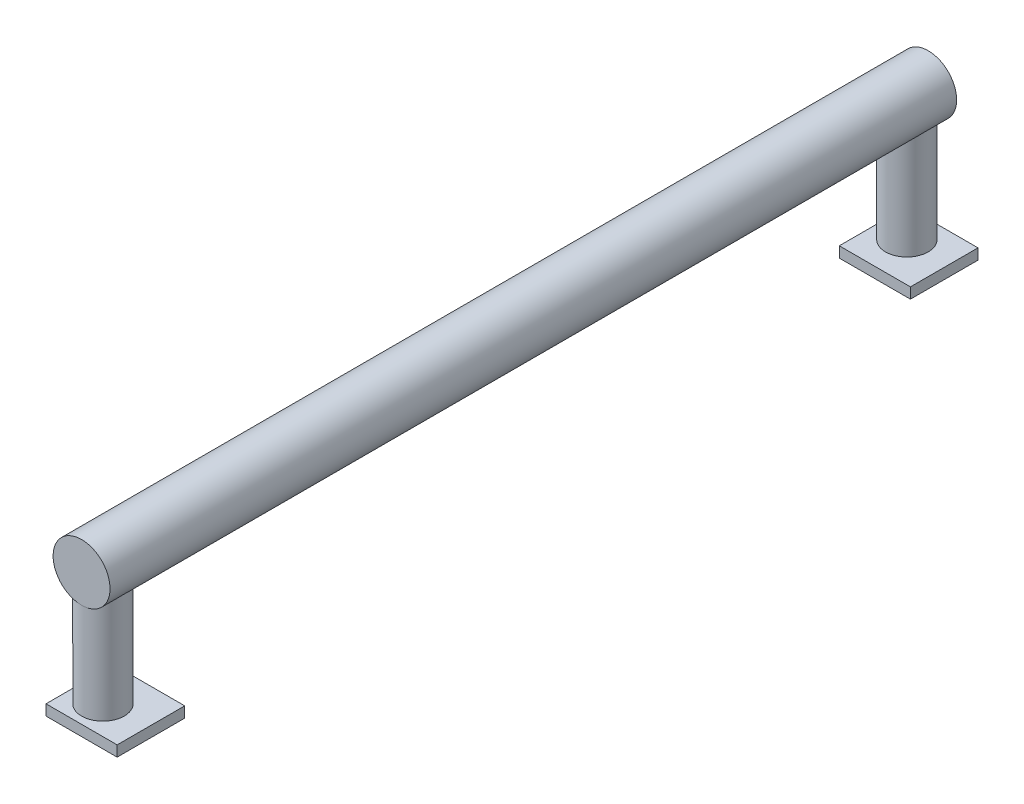
ISO-10303-21;
HEADER;
FILE_DESCRIPTION(('STEP AP214'),'2;1');
FILE_NAME('part.step','',(''),(''),'','','');
FILE_SCHEMA(('AUTOMOTIVE_DESIGN { 1 0 10303 214 1 1 1 1 }'));
ENDSEC;
DATA;
#1=APPLICATION_CONTEXT('core data for automotive mechanical design processes');
#2=APPLICATION_PROTOCOL_DEFINITION('international standard','automotive_design',2000,#1);
#3=PRODUCT_CONTEXT('',#1,'mechanical');
#4=PRODUCT('Part','Part','',(#3));
#5=PRODUCT_RELATED_PRODUCT_CATEGORY('part','',(#4));
#6=PRODUCT_DEFINITION_FORMATION('','',#4);
#7=PRODUCT_DEFINITION_CONTEXT('part definition',#1,'design');
#8=PRODUCT_DEFINITION('design','',#6,#7);
#9=PRODUCT_DEFINITION_SHAPE('','',#8);
#10=(LENGTH_UNIT() NAMED_UNIT(*) SI_UNIT(.MILLI.,.METRE.));
#11=(NAMED_UNIT(*) PLANE_ANGLE_UNIT() SI_UNIT($,.RADIAN.));
#12=(NAMED_UNIT(*) SI_UNIT($,.STERADIAN.) SOLID_ANGLE_UNIT());
#13=UNCERTAINTY_MEASURE_WITH_UNIT(LENGTH_MEASURE(1.E-05),#10,'distance_accuracy_value','');
#14=(GEOMETRIC_REPRESENTATION_CONTEXT(3) GLOBAL_UNCERTAINTY_ASSIGNED_CONTEXT((#13)) GLOBAL_UNIT_ASSIGNED_CONTEXT((#10,
#11,#12)) REPRESENTATION_CONTEXT('',''));
#15=CARTESIAN_POINT('',(0.,0.,0.));
#16=DIRECTION('',(0.,0.,1.));
#17=DIRECTION('',(1.,0.,0.));
#18=AXIS2_PLACEMENT_3D('',#15,#16,#17);
#19=CARTESIAN_POINT('',(-2.,38.,119.));
#20=DIRECTION('',(0.,0.,-1.));
#21=DIRECTION('',(-1.,0.,0.));
#22=AXIS2_PLACEMENT_3D('',#19,#20,#21);
#23=CYLINDRICAL_SURFACE('',#22,8.);
#24=CARTESIAN_POINT('',(-2.,38.,119.));
#25=DIRECTION('',(0.,0.,1.));
#26=DIRECTION('',(1.,0.,0.));
#27=AXIS2_PLACEMENT_3D('',#24,#25,#26);
#28=CIRCLE('',#27,8.);
#29=CARTESIAN_POINT('',(-2.,30.,119.));
#30=VERTEX_POINT('',#29);
#31=EDGE_CURVE('E174',#30,#30,#28,.T.);
#32=ORIENTED_EDGE('',*,*,#31,.F.);
#33=CARTESIAN_POINT('',(-2.,30.,107.));
#34=CARTESIAN_POINT('',(-2.14651868851761,30.0000013982883,107.000001448881));
#35=CARTESIAN_POINT('',(-2.29307406811185,30.004035026396,107.005376765314));
#36=CARTESIAN_POINT('',(-2.58502771834388,30.0200788549777,107.026793971473));
#37=CARTESIAN_POINT('',(-2.73042524389379,30.0320938283545,107.04284224371));
#38=CARTESIAN_POINT('',(-3.01911421051197,30.0638465696049,107.085379802046));
#39=CARTESIAN_POINT('',(-3.16240109542144,30.083599053162,107.111888984073));
#40=CARTESIAN_POINT('',(-3.44559149803457,30.1303826191203,107.174940025875));
#41=CARTESIAN_POINT('',(-3.5854934751382,30.1574169502915,107.211486363832));
#42=CARTESIAN_POINT('',(-3.86005596235382,30.2179809749031,107.293810942603));
#43=CARTESIAN_POINT('',(-3.99474491007821,30.2514667462575,107.339526837997));
#44=CARTESIAN_POINT('',(-4.25916456615398,30.3243880848115,107.439766669672));
#45=CARTESIAN_POINT('',(-4.38889328753647,30.3638260056681,107.494294090898));
#46=CARTESIAN_POINT('',(-4.76953920253634,30.4899452558965,107.67011829361));
#47=CARTESIAN_POINT('',(-5.012273741598,30.5845138159048,107.803766274043));
#48=CARTESIAN_POINT('',(-5.49390424837201,30.7980233345514,108.113063434282));
#49=CARTESIAN_POINT('',(-5.73036317555957,30.9184103024823,108.291455995929));
#50=CARTESIAN_POINT('',(-6.17211842741705,31.1693366672928,108.677996691612));
#51=CARTESIAN_POINT('',(-6.37736561247849,31.2998915938172,108.886190764897));
#52=CARTESIAN_POINT('',(-6.67986589059047,31.5101556120509,109.241071398588));
#53=CARTESIAN_POINT('',(-6.78758959632834,31.589421823506,109.379260942446));
#54=CARTESIAN_POINT('',(-6.99096674059028,31.7464621015653,109.665177543805));
#55=CARTESIAN_POINT('',(-7.08661653937946,31.8242357122553,109.812907457104));
#56=CARTESIAN_POINT('',(-7.26524223271028,31.9758044528287,110.117576909851));
#57=CARTESIAN_POINT('',(-7.34823079501831,32.0496035108309,110.274507023772));
#58=CARTESIAN_POINT('',(-7.50089012691617,32.1904400592364,110.59747433433));
#59=CARTESIAN_POINT('',(-7.5705684784342,32.257481388719,110.763506276478));
#60=CARTESIAN_POINT('',(-7.71520702483237,32.4009123462405,111.157962838089));
#61=CARTESIAN_POINT('',(-7.78504300911228,32.4737016067238,111.389703214404));
#62=CARTESIAN_POINT('',(-7.86893397672822,32.5633383544601,111.746775779162));
#63=CARTESIAN_POINT('',(-7.89341250881845,32.5899498803775,111.867306149321));
#64=CARTESIAN_POINT('',(-7.93505989442207,32.6356712225518,112.111001334768));
#65=CARTESIAN_POINT('',(-7.95223251488978,32.6547849043268,112.234164757956));
#66=CARTESIAN_POINT('',(-7.9790556619836,32.6848041011853,112.483507738135));
#67=CARTESIAN_POINT('',(-7.98863344669946,32.6956302061545,112.609704809686));
#68=CARTESIAN_POINT('',(-7.99977184971055,32.7082318903186,112.862906861699));
#69=CARTESIAN_POINT('',(-8.00133268798461,32.710007717846,112.989911819899));
#70=CARTESIAN_POINT('',(-7.99639499670828,32.704411031936,113.243605636647));
#71=CARTESIAN_POINT('',(-7.98989382945216,32.6970355243883,113.370294378144));
#72=CARTESIAN_POINT('',(-7.96899506203212,32.6735253324189,113.622165435523));
#73=CARTESIAN_POINT('',(-7.95459738141669,32.6573905587558,113.747347736043));
#74=CARTESIAN_POINT('',(-7.90390904957868,32.6012720361877,114.092599749607));
#75=CARTESIAN_POINT('',(-7.85930415163495,32.5525084951805,114.310084453616));
#76=CARTESIAN_POINT('',(-7.74822214390399,32.4354375136564,114.733816604228));
#77=CARTESIAN_POINT('',(-7.68172401138876,32.3671112965567,114.940053027047));
#78=CARTESIAN_POINT('',(-7.54333905811536,32.2312067687968,115.302535586605));
#79=CARTESIAN_POINT('',(-7.47477466886077,32.1658691893842,115.460927539078));
#80=CARTESIAN_POINT('',(-7.32546089576458,32.0292626727821,115.769264786509));
#81=CARTESIAN_POINT('',(-7.24470526282515,31.9579907021398,115.919205695107));
#82=CARTESIAN_POINT('',(-7.07146578081444,31.811857415066,116.210771068739));
#83=CARTESIAN_POINT('',(-6.97895793325039,31.7369889546789,116.352377623602));
#84=CARTESIAN_POINT('',(-6.78275541489667,31.5859075704412,116.626802307504));
#85=CARTESIAN_POINT('',(-6.6790624980525,31.5096948589477,116.759621809199));
#86=CARTESIAN_POINT('',(-6.45797922408577,31.3558283738477,117.019483960837));
#87=CARTESIAN_POINT('',(-6.34030912342671,31.2781868020496,117.146296073562));
#88=CARTESIAN_POINT('',(-6.09367222460923,31.1251974932055,117.389977037136));
#89=CARTESIAN_POINT('',(-5.96470428502757,31.0498499889683,117.506844880956));
#90=CARTESIAN_POINT('',(-5.69597060021902,30.9032976812231,117.729716189844));
#91=CARTESIAN_POINT('',(-5.55622538384286,30.8320854333905,117.835739457189));
#92=CARTESIAN_POINT('',(-5.26604522385207,30.6952982256104,118.036272685936));
#93=CARTESIAN_POINT('',(-5.1156094341371,30.6297237127685,118.130781734442));
#94=CARTESIAN_POINT('',(-4.83586827048304,30.5183054866526,118.289448504501));
#95=CARTESIAN_POINT('',(-4.70837998934683,30.4711428967607,118.355891187227));
#96=CARTESIAN_POINT('',(-4.44739928983842,30.3823083204886,118.480064701747));
#97=CARTESIAN_POINT('',(-4.31390811354258,30.3406352052135,118.537797325096));
#98=CARTESIAN_POINT('',(-4.04151155204905,30.2635757750186,118.643898411202));
#99=CARTESIAN_POINT('',(-3.90260706454456,30.2281884230903,118.692268418697));
#100=CARTESIAN_POINT('',(-3.62018599744476,30.1644437959674,118.778996945211));
#101=CARTESIAN_POINT('',(-3.47667131977366,30.1360836627363,118.817359534678));
#102=CARTESIAN_POINT('',(-3.18499204510421,30.086858658869,118.883732252647));
#103=CARTESIAN_POINT('',(-3.03680340577374,30.0660433713216,118.91167393067));
#104=CARTESIAN_POINT('',(-2.73782157199409,30.0326766113869,118.956380087926));
#105=CARTESIAN_POINT('',(-2.58702837120375,30.0201251591218,118.973144539942));
#106=CARTESIAN_POINT('',(-2.28418439033455,30.0036115625124,118.995188189966));
#107=CARTESIAN_POINT('',(-2.13213404661231,29.9996465538777,119.000471217982));
#108=CARTESIAN_POINT('',(-1.82810072219403,30.0004028609765,118.999462895463));
#109=CARTESIAN_POINT('',(-1.67611773713387,30.0051234922391,118.993172456973));
#110=CARTESIAN_POINT('',(-1.38885732653065,30.0222136134953,118.970353822955));
#111=CARTESIAN_POINT('',(-1.25344163413746,30.0337632650399,118.954922670581));
#112=CARTESIAN_POINT('',(-0.984649253020068,30.0635427405215,118.915025782578));
#113=CARTESIAN_POINT('',(-0.851273257776608,30.0817747860342,118.890557042363));
#114=CARTESIAN_POINT('',(-0.587482739790202,30.1245546726839,118.832924913315));
#115=CARTESIAN_POINT('',(-0.457067509664634,30.1491009875674,118.799763625563));
#116=CARTESIAN_POINT('',(-0.199870513613942,30.2040483182649,118.725163126504));
#117=CARTESIAN_POINT('',(-0.0730901757217983,30.2344515998443,118.683720711414));
#118=CARTESIAN_POINT('',(0.309517067364628,30.3359821879528,118.544487843983));
#119=CARTESIAN_POINT('',(0.558474973627185,30.4159100225526,118.433806524393));
#120=CARTESIAN_POINT('',(1.03411583046436,30.5933285504639,118.183298926637));
#121=CARTESIAN_POINT('',(1.26079569312708,30.6908216731712,118.043468616552));
#122=CARTESIAN_POINT('',(1.72602689058001,30.9152256305774,117.712875221749));
#123=CARTESIAN_POINT('',(1.96023886187638,31.0443302362655,117.517506089552));
#124=CARTESIAN_POINT('',(2.3949072454606,31.310467908069,117.095944697078));
#125=CARTESIAN_POINT('',(2.59528664972404,31.4475181326754,116.869684183658));
#126=CARTESIAN_POINT('',(2.8864698356734,31.6643210584706,116.486351169057));
#127=CARTESIAN_POINT('',(2.98880902725895,31.7448245789116,116.338316822413));
#128=CARTESIAN_POINT('',(3.18051065872931,31.9026478608298,116.032314005009));
#129=CARTESIAN_POINT('',(3.26986833077175,31.979966445114,115.874341914694));
#130=CARTESIAN_POINT('',(3.43468173346093,32.1283302303333,115.548997297686));
#131=CARTESIAN_POINT('',(3.51017014215579,32.1993899667166,115.381648112373));
#132=CARTESIAN_POINT('',(3.64645066864906,32.3319652962539,115.037606580636));
#133=CARTESIAN_POINT('',(3.70725497051845,32.3934887867757,114.860922129515));
#134=CARTESIAN_POINT('',(3.82460895757244,32.5152340937909,114.458383334292));
#135=CARTESIAN_POINT('',(3.87724209021695,32.5721573854536,114.230297970467));
#136=CARTESIAN_POINT('',(3.93609963223253,32.6368343980076,113.881291066224));
#137=CARTESIAN_POINT('',(3.95236673030503,32.6549378612809,113.763874574703));
#138=CARTESIAN_POINT('',(3.97795743368828,32.6835723107174,113.527390450559));
#139=CARTESIAN_POINT('',(3.98728413098441,32.6941066688848,113.408323577302));
#140=CARTESIAN_POINT('',(3.99883169968423,32.7071657047085,113.168761991903));
#141=CARTESIAN_POINT('',(4.00101405659181,32.7096469682421,113.048263043999));
#142=CARTESIAN_POINT('',(3.99811868579162,32.7063644902143,112.80746834986));
#143=CARTESIAN_POINT('',(3.99304111065808,32.7006009219258,112.687172599408));
#144=CARTESIAN_POINT('',(3.97572919486202,32.6810876600826,112.447646847338));
#145=CARTESIAN_POINT('',(3.9634882595833,32.6673306077795,112.328417930672));
#146=CARTESIAN_POINT('',(3.93208637284381,32.6324215364621,112.091928887489));
#147=CARTESIAN_POINT('',(3.91292183985972,32.6112656902905,111.974669812869));
#148=CARTESIAN_POINT('',(3.86311195375072,32.5570640711415,111.717585137071));
#149=CARTESIAN_POINT('',(3.83087573361471,32.5224327089045,111.578401943099));
#150=CARTESIAN_POINT('',(3.7572636499831,32.4451139998036,111.304704465547));
#151=CARTESIAN_POINT('',(3.7158808885681,32.4024205764453,111.170193794848));
#152=CARTESIAN_POINT('',(3.62450733742018,32.3106137158993,110.906084124199));
#153=CARTESIAN_POINT('',(3.57449949488313,32.261487607771,110.776495487104));
#154=CARTESIAN_POINT('',(3.46646540651009,32.1584824246,110.522749887657));
#155=CARTESIAN_POINT('',(3.4084416038524,32.104604799571,110.398591285412));
#156=CARTESIAN_POINT('',(3.26327089727892,31.9741797813228,110.113531526032));
#157=CARTESIAN_POINT('',(3.17300719309852,31.8962564031756,109.954840832227));
#158=CARTESIAN_POINT('',(2.97927518139015,31.7372096196496,109.647412486605));
#159=CARTESIAN_POINT('',(2.87580275952893,31.6560852226607,109.498677958096));
#160=CARTESIAN_POINT('',(2.65600132814069,31.4930505710786,109.211280145984));
#161=CARTESIAN_POINT('',(2.53966269090389,31.4111397704523,109.072624534713));
#162=CARTESIAN_POINT('',(2.29448893143749,31.2487790785597,108.805936854109));
#163=CARTESIAN_POINT('',(2.16565532793775,31.168329011153,108.677903497171));
#164=CARTESIAN_POINT('',(1.89458755688542,31.0102207620581,108.432074742258));
#165=CARTESIAN_POINT('',(1.75224983935817,30.932591736701,108.314374460691));
#166=CARTESIAN_POINT('',(1.45541107812881,30.7828143209134,108.091376006562));
#167=CARTESIAN_POINT('',(1.30090844848122,30.7106666475066,107.986079455563));
#168=CARTESIAN_POINT('',(0.980611436470356,30.5739499714069,107.789317467789));
#169=CARTESIAN_POINT('',(0.814839343145992,30.5093666594798,107.697825819028));
#170=CARTESIAN_POINT('',(0.472665900366074,30.3895642279134,107.529881558582));
#171=CARTESIAN_POINT('',(0.29627009831926,30.3343402775569,107.453421185412));
#172=CARTESIAN_POINT('',(-0.0127007534033492,30.2496277909862,107.337018861803));
#173=CARTESIAN_POINT('',(-0.142967953511653,30.2173401364328,107.292941606809));
#174=CARTESIAN_POINT('',(-0.407486390523727,30.1589396031719,107.213554368136));
#175=CARTESIAN_POINT('',(-0.541736651119853,30.1328252251478,107.178242255543));
#176=CARTESIAN_POINT('',(-0.813129284043095,30.0873374542946,107.116918323619));
#177=CARTESIAN_POINT('',(-0.950264180180657,30.0679484803017,107.09088500362));
#178=CARTESIAN_POINT('',(-1.22676767892853,30.0362411542406,107.048390432802));
#179=CARTESIAN_POINT('',(-1.36613510169996,30.0239191864075,107.031924286976));
#180=CARTESIAN_POINT('',(-1.58813127445318,30.0101859849803,107.013586558735));
#181=CARTESIAN_POINT('',(-1.67036403162887,30.0063696580895,107.008495078511));
#182=CARTESIAN_POINT('',(-1.83506062721647,30.0012760676831,107.001701118577));
#183=CARTESIAN_POINT('',(-1.91752450068857,29.9999992129023,106.999999184424));
#184=CARTESIAN_POINT('',(-2.,30.,107.));
#185=B_SPLINE_CURVE_WITH_KNOTS('',3,(#33,#34,#35,#36,#37,#38,#39,#40,#41,#42,#43,#44,#45,#46,
#47,#48,#49,#50,#51,#52,#53,#54,#55,#56,#57,#58,#59,#60,#61,#62,#63,#64,#65,#66,#67,#68,#69,#70,
#71,#72,#73,#74,#75,#76,#77,#78,#79,#80,#81,#82,#83,#84,#85,#86,#87,#88,#89,#90,#91,#92,#93,#94,
#95,#96,#97,#98,#99,#100,#101,#102,#103,#104,#105,#106,#107,#108,#109,#110,#111,#112,#113,#114,
#115,#116,#117,#118,#119,#120,#121,#122,#123,#124,#125,#126,#127,#128,#129,#130,#131,#132,#133,
#134,#135,#136,#137,#138,#139,#140,#141,#142,#143,#144,#145,#146,#147,#148,#149,#150,#151,#152,
#153,#154,#155,#156,#157,#158,#159,#160,#161,#162,#163,#164,#165,#166,#167,#168,#169,#170,#171,
#172,#173,#174,#175,#176,#177,#178,#179,#180,#181,#182,#183,#184),.UNSPECIFIED.,.T.,.F.,(4,2,2,
2,2,2,2,2,2,2,2,2,2,2,2,2,2,2,2,2,2,2,2,2,2,2,2,2,2,2,2,2,2,2,2,2,2,2,2,2,2,2,2,2,2,2,2,2,2,2,2,
2,2,2,2,2,2,2,2,2,2,2,2,2,2,2,2,2,2,2,2,2,2,2,2,4),(0.,0.439467048380188,0.87919713813798,
1.31976762661366,1.76053500052094,2.19840134580812,2.63644129232571,3.51138555342936,
4.46735321072937,5.42481069423868,6.00121633672615,6.5777953264835,7.15379360241392,
7.72946278616467,8.48458056510052,8.86171322500427,9.23865119759489,9.61915721770107,
9.99965279695981,10.3802728986115,10.7608968781809,11.4400527126809,12.1198626101981,
12.672786977991,13.2259957371829,13.7803528972941,14.3346232539533,14.9028885365166,
15.4712112974089,16.0384770407194,16.6057877301158,17.0592631596222,17.5126451871165,
17.9659523472327,18.4190748392931,18.8751233602148,19.331172991604,19.7870704692073,
20.2429320214021,20.6527966790804,21.0627977208993,21.4726997523065,21.8827606737579,
22.7310038456726,23.5793644254271,24.5694015495635,25.5616626256785,26.1525200779509,
26.7435939942103,27.3332568743274,27.9224287902262,28.6419314131392,29.0012926759906,
29.3604937454876,29.7216280742576,30.0827548135648,30.4442145316699,30.8058614984406,
31.2462116660306,31.6868950664313,32.1284599525693,32.5698905501963,33.1645896617994,
33.7594744680457,34.3548074740318,34.9500682093495,35.550333147422,36.1506764723156,
36.7498651522012,37.3487436202511,37.7721112122056,38.1953758741032,38.6176532780525,
39.039714434693,39.2870510185101,39.5344274085992),.UNSPECIFIED.);
#186=EDGE_CURVE('E11',#30,#30,#185,.T.);
#187=ORIENTED_EDGE('',*,*,#186,.T.);
#188=EDGE_LOOP('',(#32,#187));
#189=FACE_BOUND('',#188,.T.);
#190=CARTESIAN_POINT('',(-2.,38.,-119.));
#191=DIRECTION('',(0.,0.,1.));
#192=DIRECTION('',(1.,0.,0.));
#193=AXIS2_PLACEMENT_3D('',#190,#191,#192);
#194=CIRCLE('',#193,8.);
#195=CARTESIAN_POINT('',(-2.,30.,-119.));
#196=VERTEX_POINT('',#195);
#197=EDGE_CURVE('E168',#196,#196,#194,.T.);
#198=ORIENTED_EDGE('',*,*,#197,.T.);
#199=CARTESIAN_POINT('',(-2.,30.,-119.));
#200=CARTESIAN_POINT('',(-1.85348131148239,30.0000013982883,-118.999998551119));
#201=CARTESIAN_POINT('',(-1.70692593188815,30.004035026396,-118.994623234686));
#202=CARTESIAN_POINT('',(-1.41497228165612,30.0200788549777,-118.973206028527));
#203=CARTESIAN_POINT('',(-1.26957475610621,30.0320938283545,-118.95715775629));
#204=CARTESIAN_POINT('',(-0.980885789488029,30.0638465696049,-118.914620197954));
#205=CARTESIAN_POINT('',(-0.837598904578553,30.083599053162,-118.888111015927));
#206=CARTESIAN_POINT('',(-0.554408501965431,30.1303826191203,-118.825059974125));
#207=CARTESIAN_POINT('',(-0.414506524861798,30.1574169502915,-118.788513636168));
#208=CARTESIAN_POINT('',(-0.139944037646186,30.2179809749031,-118.706189057397));
#209=CARTESIAN_POINT('',(-0.00525508992179119,30.2514667462575,-118.660473162003));
#210=CARTESIAN_POINT('',(0.25916456615398,30.3243880848115,-118.560233330328));
#211=CARTESIAN_POINT('',(0.388893287536473,30.3638260056681,-118.505705909102));
#212=CARTESIAN_POINT('',(0.769539202536344,30.4899452558965,-118.32988170639));
#213=CARTESIAN_POINT('',(1.012273741598,30.5845138159048,-118.196233725957));
#214=CARTESIAN_POINT('',(1.49390424837201,30.7980233345514,-117.886936565718));
#215=CARTESIAN_POINT('',(1.73036317555957,30.9184103024823,-117.708544004071));
#216=CARTESIAN_POINT('',(2.17211842741705,31.1693366672928,-117.322003308388));
#217=CARTESIAN_POINT('',(2.37736561247849,31.2998915938172,-117.113809235103));
#218=CARTESIAN_POINT('',(2.67986589059047,31.5101556120509,-116.758928601412));
#219=CARTESIAN_POINT('',(2.78758959632833,31.589421823506,-116.620739057554));
#220=CARTESIAN_POINT('',(2.99096674059027,31.7464621015653,-116.334822456195));
#221=CARTESIAN_POINT('',(3.08661653937945,31.8242357122553,-116.187092542896));
#222=CARTESIAN_POINT('',(3.26524223271027,31.9758044528287,-115.882423090149));
#223=CARTESIAN_POINT('',(3.3482307950183,32.0496035108309,-115.725492976228));
#224=CARTESIAN_POINT('',(3.50089012691617,32.1904400592364,-115.40252566567));
#225=CARTESIAN_POINT('',(3.57056847843419,32.257481388719,-115.236493723522));
#226=CARTESIAN_POINT('',(3.71520702483237,32.4009123462405,-114.842037161911));
#227=CARTESIAN_POINT('',(3.78504300911228,32.4737016067238,-114.610296785596));
#228=CARTESIAN_POINT('',(3.86893397672821,32.5633383544601,-114.253224220838));
#229=CARTESIAN_POINT('',(3.89341250881845,32.5899498803775,-114.132693850679));
#230=CARTESIAN_POINT('',(3.93505989442207,32.6356712225518,-113.888998665232));
#231=CARTESIAN_POINT('',(3.95223251488978,32.6547849043268,-113.765835242044));
#232=CARTESIAN_POINT('',(3.9790556619836,32.6848041011853,-113.516492261865));
#233=CARTESIAN_POINT('',(3.98863344669945,32.6956302061545,-113.390295190315));
#234=CARTESIAN_POINT('',(3.99977184971055,32.7082318903186,-113.137093138301));
#235=CARTESIAN_POINT('',(4.00133268798461,32.710007717846,-113.010088180101));
#236=CARTESIAN_POINT('',(3.99639499670829,32.704411031936,-112.756394363353));
#237=CARTESIAN_POINT('',(3.98989382945216,32.6970355243884,-112.629705621856));
#238=CARTESIAN_POINT('',(3.96899506203212,32.6735253324189,-112.377834564477));
#239=CARTESIAN_POINT('',(3.9545973814167,32.6573905587558,-112.252652263957));
#240=CARTESIAN_POINT('',(3.90390904957868,32.6012720361877,-111.907400250393));
#241=CARTESIAN_POINT('',(3.85930415163496,32.5525084951805,-111.689915546384));
#242=CARTESIAN_POINT('',(3.748222143904,32.4354375136565,-111.266183395772));
#243=CARTESIAN_POINT('',(3.68172401138878,32.3671112965567,-111.059946972953));
#244=CARTESIAN_POINT('',(3.54333905811538,32.2312067687968,-110.697464413395));
#245=CARTESIAN_POINT('',(3.47477466886079,32.1658691893843,-110.539072460922));
#246=CARTESIAN_POINT('',(3.32546089576461,32.0292626727821,-110.230735213491));
#247=CARTESIAN_POINT('',(3.24470526282518,31.9579907021398,-110.080794304893));
#248=CARTESIAN_POINT('',(3.07146578081447,31.811857415066,-109.789228931261));
#249=CARTESIAN_POINT('',(2.97895793325043,31.7369889546789,-109.647622376398));
#250=CARTESIAN_POINT('',(2.78275541489672,31.5859075704412,-109.373197692496));
#251=CARTESIAN_POINT('',(2.67906249805255,31.5096948589477,-109.240378190801));
#252=CARTESIAN_POINT('',(2.45797922408582,31.3558283738477,-108.980516039163));
#253=CARTESIAN_POINT('',(2.34030912342677,31.2781868020497,-108.853703926438));
#254=CARTESIAN_POINT('',(2.09367222460928,31.1251974932056,-108.610022962864));
#255=CARTESIAN_POINT('',(1.96470428502763,31.0498499889683,-108.493155119044));
#256=CARTESIAN_POINT('',(1.69597060021909,30.9032976812231,-108.270283810156));
#257=CARTESIAN_POINT('',(1.55622538384293,30.8320854333905,-108.164260542811));
#258=CARTESIAN_POINT('',(1.26604522385214,30.6952982256105,-107.963727314064));
#259=CARTESIAN_POINT('',(1.11560943413717,30.6297237127685,-107.869218265559));
#260=CARTESIAN_POINT('',(0.835868270483112,30.5183054866526,-107.710551495499));
#261=CARTESIAN_POINT('',(0.708379989346898,30.4711428967607,-107.644108812773));
#262=CARTESIAN_POINT('',(0.44739928983849,30.3823083204886,-107.519935298253));
#263=CARTESIAN_POINT('',(0.313908113542655,30.3406352052135,-107.462202674904));
#264=CARTESIAN_POINT('',(0.0415115520491223,30.2635757750187,-107.356101588798));
#265=CARTESIAN_POINT('',(-0.0973929354553698,30.2281884230903,-107.307731581303));
#266=CARTESIAN_POINT('',(-0.37981400255517,30.1644437959674,-107.221003054789));
#267=CARTESIAN_POINT('',(-0.52332868022627,30.1360836627363,-107.182640465322));
#268=CARTESIAN_POINT('',(-0.815007954895718,30.086858658869,-107.116267747353));
#269=CARTESIAN_POINT('',(-0.963196594226187,30.0660433713217,-107.08832606933));
#270=CARTESIAN_POINT('',(-1.26217842800584,30.0326766113869,-107.043619912074));
#271=CARTESIAN_POINT('',(-1.41297162879618,30.0201251591218,-107.026855460058));
#272=CARTESIAN_POINT('',(-1.71581560966538,30.0036115625124,-107.004811810034));
#273=CARTESIAN_POINT('',(-1.86786595338762,29.9996465538777,-106.999528782018));
#274=CARTESIAN_POINT('',(-2.1718992778059,30.0004028609765,-107.000537104537));
#275=CARTESIAN_POINT('',(-2.32388226286607,30.0051234922391,-107.006827543027));
#276=CARTESIAN_POINT('',(-2.61114267346929,30.0222136134953,-107.029646177045));
#277=CARTESIAN_POINT('',(-2.74655836586248,30.0337632650399,-107.045077329419));
#278=CARTESIAN_POINT('',(-3.01535074697988,30.0635427405215,-107.084974217422));
#279=CARTESIAN_POINT('',(-3.14872674222334,30.0817747860342,-107.109442957637));
#280=CARTESIAN_POINT('',(-3.41251726020974,30.1245546726839,-107.167075086685));
#281=CARTESIAN_POINT('',(-3.54293249033531,30.1491009875674,-107.200236374437));
#282=CARTESIAN_POINT('',(-3.800129486386,30.2040483182649,-107.274836873496));
#283=CARTESIAN_POINT('',(-3.92690982427815,30.2344515998443,-107.316279288586));
#284=CARTESIAN_POINT('',(-4.30951706736458,30.3359821879528,-107.455512156017));
#285=CARTESIAN_POINT('',(-4.55847497362713,30.4159100225526,-107.566193475607));
#286=CARTESIAN_POINT('',(-5.03411583046431,30.5933285504639,-107.816701073363));
#287=CARTESIAN_POINT('',(-5.26079569312703,30.6908216731711,-107.956531383448));
#288=CARTESIAN_POINT('',(-5.72602689057996,30.9152256305774,-108.287124778251));
#289=CARTESIAN_POINT('',(-5.96023886187633,31.0443302362654,-108.482493910448));
#290=CARTESIAN_POINT('',(-6.39490724546056,31.310467908069,-108.904055302922));
#291=CARTESIAN_POINT('',(-6.595286649724,31.4475181326753,-109.130315816342));
#292=CARTESIAN_POINT('',(-6.88646983567336,31.6643210584706,-109.513648830943));
#293=CARTESIAN_POINT('',(-6.9888090272589,31.7448245789115,-109.661683177587));
#294=CARTESIAN_POINT('',(-7.18051065872927,31.9026478608298,-109.967685994991));
#295=CARTESIAN_POINT('',(-7.26986833077171,31.9799664451139,-110.125658085305));
#296=CARTESIAN_POINT('',(-7.4346817334609,32.1283302303333,-110.451002702314));
#297=CARTESIAN_POINT('',(-7.51017014215576,32.1993899667166,-110.618351887627));
#298=CARTESIAN_POINT('',(-7.64645066864904,32.3319652962539,-110.962393419364));
#299=CARTESIAN_POINT('',(-7.70725497051842,32.3934887867757,-111.139077870485));
#300=CARTESIAN_POINT('',(-7.82460895757242,32.5152340937909,-111.541616665708));
#301=CARTESIAN_POINT('',(-7.87724209021693,32.5721573854536,-111.769702029532));
#302=CARTESIAN_POINT('',(-7.93609963223252,32.6368343980076,-112.118708933776));
#303=CARTESIAN_POINT('',(-7.95236673030502,32.6549378612809,-112.236125425297));
#304=CARTESIAN_POINT('',(-7.97795743368828,32.6835723107174,-112.472609549441));
#305=CARTESIAN_POINT('',(-7.98728413098441,32.6941066688848,-112.591676422698));
#306=CARTESIAN_POINT('',(-7.99883169968423,32.7071657047085,-112.831238008097));
#307=CARTESIAN_POINT('',(-8.00101405659181,32.7096469682421,-112.951736956001));
#308=CARTESIAN_POINT('',(-7.99811868579162,32.7063644902143,-113.19253165014));
#309=CARTESIAN_POINT('',(-7.99304111065809,32.7006009219258,-113.312827400592));
#310=CARTESIAN_POINT('',(-7.97572919486202,32.6810876600826,-113.552353152662));
#311=CARTESIAN_POINT('',(-7.9634882595833,32.6673306077795,-113.671582069328));
#312=CARTESIAN_POINT('',(-7.93208637284381,32.6324215364621,-113.908071112511));
#313=CARTESIAN_POINT('',(-7.91292183985972,32.6112656902905,-114.025330187131));
#314=CARTESIAN_POINT('',(-7.86311195375072,32.5570640711415,-114.282414862929));
#315=CARTESIAN_POINT('',(-7.83087573361472,32.5224327089045,-114.421598056901));
#316=CARTESIAN_POINT('',(-7.75726364998311,32.4451139998036,-114.695295534453));
#317=CARTESIAN_POINT('',(-7.7158808885681,32.4024205764453,-114.829806205152));
#318=CARTESIAN_POINT('',(-7.62450733742019,32.3106137158993,-115.093915875801));
#319=CARTESIAN_POINT('',(-7.57449949488315,32.2614876077711,-115.223504512896));
#320=CARTESIAN_POINT('',(-7.46646540651011,32.1584824246001,-115.477250112343));
#321=CARTESIAN_POINT('',(-7.40844160385242,32.1046047995711,-115.601408714588));
#322=CARTESIAN_POINT('',(-7.26327089727895,31.9741797813228,-115.886468473968));
#323=CARTESIAN_POINT('',(-7.17300719309855,31.8962564031756,-116.045159167773));
#324=CARTESIAN_POINT('',(-6.97927518139019,31.7372096196496,-116.352587513395));
#325=CARTESIAN_POINT('',(-6.87580275952896,31.6560852226607,-116.501322041904));
#326=CARTESIAN_POINT('',(-6.65600132814073,31.4930505710786,-116.788719854016));
#327=CARTESIAN_POINT('',(-6.53966269090392,31.4111397704523,-116.927375465287));
#328=CARTESIAN_POINT('',(-6.29448893143753,31.2487790785598,-117.194063145891));
#329=CARTESIAN_POINT('',(-6.16565532793779,31.168329011153,-117.322096502829));
#330=CARTESIAN_POINT('',(-5.89458755688547,31.0102207620582,-117.567925257742));
#331=CARTESIAN_POINT('',(-5.75224983935822,30.932591736701,-117.685625539309));
#332=CARTESIAN_POINT('',(-5.45541107812887,30.7828143209134,-117.908623993437));
#333=CARTESIAN_POINT('',(-5.30090844848128,30.7106666475066,-118.013920544437));
#334=CARTESIAN_POINT('',(-4.98061143647042,30.573949971407,-118.210682532211));
#335=CARTESIAN_POINT('',(-4.81483934314606,30.5093666594798,-118.302174180972));
#336=CARTESIAN_POINT('',(-4.47266590036614,30.3895642279134,-118.470118441418));
#337=CARTESIAN_POINT('',(-4.29627009831933,30.334340277557,-118.546578814588));
#338=CARTESIAN_POINT('',(-3.98729924659672,30.2496277909862,-118.662981138197));
#339=CARTESIAN_POINT('',(-3.85703204648842,30.2173401364328,-118.707058393191));
#340=CARTESIAN_POINT('',(-3.59251360947635,30.1589396031719,-118.786445631864));
#341=CARTESIAN_POINT('',(-3.45826334888022,30.1328252251478,-118.821757744457));
#342=CARTESIAN_POINT('',(-3.18687071595698,30.0873374542946,-118.883081676381));
#343=CARTESIAN_POINT('',(-3.04973581981942,30.0679484803017,-118.90911499638));
#344=CARTESIAN_POINT('',(-2.77323232107155,30.0362411542406,-118.951609567198));
#345=CARTESIAN_POINT('',(-2.63386489830012,30.0239191864075,-118.968075713024));
#346=CARTESIAN_POINT('',(-2.41186872554689,30.0101859849803,-118.986413441265));
#347=CARTESIAN_POINT('',(-2.32963596837118,30.0063696580895,-118.991504921489));
#348=CARTESIAN_POINT('',(-2.16493937278356,30.0012760676831,-118.998298881423));
#349=CARTESIAN_POINT('',(-2.08247549931145,29.9999992129023,-119.000000815576));
#350=CARTESIAN_POINT('',(-2.,30.,-119.));
#351=B_SPLINE_CURVE_WITH_KNOTS('',3,(#199,#200,#201,#202,#203,#204,#205,#206,#207,#208,#209,
#210,#211,#212,#213,#214,#215,#216,#217,#218,#219,#220,#221,#222,#223,#224,#225,#226,#227,#228,
#229,#230,#231,#232,#233,#234,#235,#236,#237,#238,#239,#240,#241,#242,#243,#244,#245,#246,#247,
#248,#249,#250,#251,#252,#253,#254,#255,#256,#257,#258,#259,#260,#261,#262,#263,#264,#265,#266,
#267,#268,#269,#270,#271,#272,#273,#274,#275,#276,#277,#278,#279,#280,#281,#282,#283,#284,#285,
#286,#287,#288,#289,#290,#291,#292,#293,#294,#295,#296,#297,#298,#299,#300,#301,#302,#303,#304,
#305,#306,#307,#308,#309,#310,#311,#312,#313,#314,#315,#316,#317,#318,#319,#320,#321,#322,#323,
#324,#325,#326,#327,#328,#329,#330,#331,#332,#333,#334,#335,#336,#337,#338,#339,#340,#341,#342,
#343,#344,#345,#346,#347,#348,#349,#350),.UNSPECIFIED.,.T.,.F.,(4,2,2,2,2,2,2,2,2,2,2,2,2,2,2,2,
2,2,2,2,2,2,2,2,2,2,2,2,2,2,2,2,2,2,2,2,2,2,2,2,2,2,2,2,2,2,2,2,2,2,2,2,2,2,2,2,2,2,2,2,2,2,2,2,
2,2,2,2,2,2,2,2,2,2,2,4),(0.,0.439467048380189,0.879197138137981,1.31976762661366,
1.76053500052094,2.19840134580811,2.63644129232571,3.51138555342936,4.46735321072937,
5.42481069423868,6.00121633672613,6.5777953264835,7.1537936024139,7.72946278616465,
8.4845805651005,8.86171322500424,9.23865119759486,9.61915721770104,9.99965279695975,
10.3802728986114,10.7608968781809,11.4400527126809,12.1198626101981,12.672786977991,
13.2259957371829,13.780352897294,14.3346232539532,14.9028885365165,15.4712112974088,
16.0384770407193,16.6057877301157,17.0592631596221,17.5126451871165,17.9659523472326,
18.4190748392931,18.8751233602148,19.331172991604,19.7870704692072,20.2429320214021,
20.6527966790803,21.0627977208993,21.4726997523064,21.8827606737578,22.7310038456726,
23.579364425427,24.5694015495634,25.5616626256784,26.1525200779508,26.7435939942102,
27.3332568743273,27.9224287902261,28.6419314131391,29.0012926759905,29.3604937454875,
29.7216280742576,30.0827548135647,30.4442145316699,30.8058614984406,31.2462116660305,
31.6868950664312,32.1284599525693,32.5698905501962,33.1645896617993,33.7594744680456,
34.3548074740317,34.9500682093494,35.5503331474219,36.1506764723155,36.7498651522011,
37.348743620251,37.7721112122056,38.1953758741031,38.6176532780524,39.0397144346929,
39.2870510185101,39.5344274085992),.UNSPECIFIED.);
#352=EDGE_CURVE('E158',#196,#196,#351,.T.);
#353=ORIENTED_EDGE('',*,*,#352,.F.);
#354=EDGE_LOOP('',(#198,#353));
#355=FACE_BOUND('',#354,.T.);
#356=ADVANCED_FACE('F43',(#189,#355),#23,.T.);
#357=CARTESIAN_POINT('',(-2.,38.,113.));
#358=DIRECTION('',(0.,-1.,0.));
#359=DIRECTION('',(0.,0.,-1.));
#360=AXIS2_PLACEMENT_3D('',#357,#358,#359);
#361=CYLINDRICAL_SURFACE('',#360,6.);
#362=CARTESIAN_POINT('',(-2.,3.,113.));
#363=DIRECTION('',(0.,1.,0.));
#364=DIRECTION('',(0.,0.,1.));
#365=AXIS2_PLACEMENT_3D('',#362,#363,#364);
#366=CIRCLE('',#365,6.);
#367=CARTESIAN_POINT('',(-2.,3.,119.));
#368=VERTEX_POINT('',#367);
#369=EDGE_CURVE('E60',#368,#368,#366,.T.);
#370=ORIENTED_EDGE('',*,*,#369,.T.);
#371=EDGE_LOOP('',(#370));
#372=FACE_BOUND('',#371,.T.);
#373=ORIENTED_EDGE('',*,*,#186,.F.);
#374=EDGE_LOOP('',(#373));
#375=FACE_BOUND('',#374,.T.);
#376=ADVANCED_FACE('F207',(#372,#375),#361,.T.);
#377=CARTESIAN_POINT('',(-10.,3.,102.));
#378=DIRECTION('',(1.,0.,0.));
#379=DIRECTION('',(0.,0.,-1.));
#380=AXIS2_PLACEMENT_3D('',#377,#378,#379);
#381=PLANE('',#380);
#382=DIRECTION('',(0.,0.,1.));
#383=VECTOR('',#382,1.);
#384=CARTESIAN_POINT('',(-10.,0.,102.));
#385=LINE('',#384,#383);
#386=CARTESIAN_POINT('',(-10.,0.,102.));
#387=VERTEX_POINT('',#386);
#388=CARTESIAN_POINT('',(-10.,0.,121.));
#389=VERTEX_POINT('',#388);
#390=EDGE_CURVE('E219',#387,#389,#385,.T.);
#391=ORIENTED_EDGE('',*,*,#390,.T.);
#392=DIRECTION('',(0.,-1.,0.));
#393=VECTOR('',#392,1.);
#394=CARTESIAN_POINT('',(-10.,3.,121.));
#395=LINE('',#394,#393);
#396=CARTESIAN_POINT('',(-10.,3.,121.));
#397=VERTEX_POINT('',#396);
#398=EDGE_CURVE('E221',#397,#389,#395,.T.);
#399=ORIENTED_EDGE('',*,*,#398,.F.);
#400=DIRECTION('',(0.,0.,1.));
#401=VECTOR('',#400,1.);
#402=CARTESIAN_POINT('',(-10.,3.,102.));
#403=LINE('',#402,#401);
#404=CARTESIAN_POINT('',(-10.,3.,102.));
#405=VERTEX_POINT('',#404);
#406=EDGE_CURVE('E223',#405,#397,#403,.T.);
#407=ORIENTED_EDGE('',*,*,#406,.F.);
#408=DIRECTION('',(0.,-1.,0.));
#409=VECTOR('',#408,1.);
#410=CARTESIAN_POINT('',(-10.,3.,102.));
#411=LINE('',#410,#409);
#412=EDGE_CURVE('E232',#405,#387,#411,.T.);
#413=ORIENTED_EDGE('',*,*,#412,.T.);
#414=EDGE_LOOP('',(#391,#399,#407,#413));
#415=FACE_BOUND('',#414,.T.);
#416=ADVANCED_FACE('F44',(#415),#381,.F.);
#417=CARTESIAN_POINT('',(-10.,3.,121.));
#418=DIRECTION('',(0.,0.,-1.));
#419=DIRECTION('',(-1.,0.,0.));
#420=AXIS2_PLACEMENT_3D('',#417,#418,#419);
#421=PLANE('',#420);
#422=DIRECTION('',(1.,0.,0.));
#423=VECTOR('',#422,1.);
#424=CARTESIAN_POINT('',(-10.,0.,121.));
#425=LINE('',#424,#423);
#426=CARTESIAN_POINT('',(10.,0.,121.));
#427=VERTEX_POINT('',#426);
#428=EDGE_CURVE('E234',#389,#427,#425,.T.);
#429=ORIENTED_EDGE('',*,*,#428,.T.);
#430=DIRECTION('',(0.,-1.,0.));
#431=VECTOR('',#430,1.);
#432=CARTESIAN_POINT('',(10.,3.,121.));
#433=LINE('',#432,#431);
#434=CARTESIAN_POINT('',(10.,3.,121.));
#435=VERTEX_POINT('',#434);
#436=EDGE_CURVE('E244',#435,#427,#433,.T.);
#437=ORIENTED_EDGE('',*,*,#436,.F.);
#438=DIRECTION('',(1.,0.,0.));
#439=VECTOR('',#438,1.);
#440=CARTESIAN_POINT('',(-10.,3.,121.));
#441=LINE('',#440,#439);
#442=EDGE_CURVE('E100',#397,#435,#441,.T.);
#443=ORIENTED_EDGE('',*,*,#442,.F.);
#444=ORIENTED_EDGE('',*,*,#398,.T.);
#445=EDGE_LOOP('',(#429,#437,#443,#444));
#446=FACE_BOUND('',#445,.T.);
#447=ADVANCED_FACE('F245',(#446),#421,.F.);
#448=CARTESIAN_POINT('',(10.,3.,121.));
#449=DIRECTION('',(-1.,0.,0.));
#450=DIRECTION('',(0.,0.,1.));
#451=AXIS2_PLACEMENT_3D('',#448,#449,#450);
#452=PLANE('',#451);
#453=DIRECTION('',(0.,0.,-1.));
#454=VECTOR('',#453,1.);
#455=CARTESIAN_POINT('',(10.,0.,121.));
#456=LINE('',#455,#454);
#457=CARTESIAN_POINT('',(10.,0.,102.));
#458=VERTEX_POINT('',#457);
#459=EDGE_CURVE('E83',#427,#458,#456,.T.);
#460=ORIENTED_EDGE('',*,*,#459,.T.);
#461=DIRECTION('',(0.,-1.,0.));
#462=VECTOR('',#461,1.);
#463=CARTESIAN_POINT('',(10.,3.,102.));
#464=LINE('',#463,#462);
#465=CARTESIAN_POINT('',(10.,3.,102.));
#466=VERTEX_POINT('',#465);
#467=EDGE_CURVE('E239',#466,#458,#464,.T.);
#468=ORIENTED_EDGE('',*,*,#467,.F.);
#469=DIRECTION('',(0.,0.,-1.));
#470=VECTOR('',#469,1.);
#471=CARTESIAN_POINT('',(10.,3.,121.));
#472=LINE('',#471,#470);
#473=EDGE_CURVE('E230',#435,#466,#472,.T.);
#474=ORIENTED_EDGE('',*,*,#473,.F.);
#475=ORIENTED_EDGE('',*,*,#436,.T.);
#476=EDGE_LOOP('',(#460,#468,#474,#475));
#477=FACE_BOUND('',#476,.T.);
#478=ADVANCED_FACE('F257',(#477),#452,.F.);
#479=CARTESIAN_POINT('',(10.,3.,102.));
#480=DIRECTION('',(0.,0.,1.));
#481=DIRECTION('',(1.,0.,0.));
#482=AXIS2_PLACEMENT_3D('',#479,#480,#481);
#483=PLANE('',#482);
#484=DIRECTION('',(-1.,0.,0.));
#485=VECTOR('',#484,1.);
#486=CARTESIAN_POINT('',(10.,0.,102.));
#487=LINE('',#486,#485);
#488=EDGE_CURVE('E90',#458,#387,#487,.T.);
#489=ORIENTED_EDGE('',*,*,#488,.T.);
#490=ORIENTED_EDGE('',*,*,#412,.F.);
#491=DIRECTION('',(-1.,0.,0.));
#492=VECTOR('',#491,1.);
#493=CARTESIAN_POINT('',(10.,3.,102.));
#494=LINE('',#493,#492);
#495=EDGE_CURVE('E62',#466,#405,#494,.T.);
#496=ORIENTED_EDGE('',*,*,#495,.F.);
#497=ORIENTED_EDGE('',*,*,#467,.T.);
#498=EDGE_LOOP('',(#489,#490,#496,#497));
#499=FACE_BOUND('',#498,.T.);
#500=ADVANCED_FACE('F255',(#499),#483,.F.);
#501=CARTESIAN_POINT('',(0.,3.,0.));
#502=DIRECTION('',(0.,1.,0.));
#503=DIRECTION('',(0.,0.,1.));
#504=AXIS2_PLACEMENT_3D('',#501,#502,#503);
#505=PLANE('',#504);
#506=ORIENTED_EDGE('',*,*,#369,.F.);
#507=EDGE_LOOP('',(#506));
#508=FACE_BOUND('',#507,.T.);
#509=ORIENTED_EDGE('',*,*,#406,.T.);
#510=ORIENTED_EDGE('',*,*,#442,.T.);
#511=ORIENTED_EDGE('',*,*,#473,.T.);
#512=ORIENTED_EDGE('',*,*,#495,.T.);
#513=EDGE_LOOP('',(#509,#510,#511,#512));
#514=FACE_BOUND('',#513,.T.);
#515=ADVANCED_FACE('F249',(#508,#514),#505,.T.);
#516=CARTESIAN_POINT('',(0.,0.,0.));
#517=DIRECTION('',(0.,1.,0.));
#518=DIRECTION('',(0.,0.,1.));
#519=AXIS2_PLACEMENT_3D('',#516,#517,#518);
#520=PLANE('',#519);
#521=ORIENTED_EDGE('',*,*,#390,.F.);
#522=ORIENTED_EDGE('',*,*,#488,.F.);
#523=ORIENTED_EDGE('',*,*,#459,.F.);
#524=ORIENTED_EDGE('',*,*,#428,.F.);
#525=EDGE_LOOP('',(#521,#522,#523,#524));
#526=FACE_BOUND('',#525,.T.);
#527=ADVANCED_FACE('F205',(#526),#520,.F.);
#528=CARTESIAN_POINT('',(-2.,38.,119.));
#529=DIRECTION('',(0.,0.,1.));
#530=DIRECTION('',(1.,0.,0.));
#531=AXIS2_PLACEMENT_3D('',#528,#529,#530);
#532=PLANE('',#531);
#533=ORIENTED_EDGE('',*,*,#31,.T.);
#534=EDGE_LOOP('',(#533));
#535=FACE_BOUND('',#534,.T.);
#536=ADVANCED_FACE('F199',(#535),#532,.T.);
#537=CARTESIAN_POINT('',(-2.,38.,-119.));
#538=DIRECTION('',(0.,0.,1.));
#539=DIRECTION('',(1.,0.,0.));
#540=AXIS2_PLACEMENT_3D('',#537,#538,#539);
#541=PLANE('',#540);
#542=ORIENTED_EDGE('',*,*,#197,.F.);
#543=EDGE_LOOP('',(#542));
#544=FACE_BOUND('',#543,.T.);
#545=ADVANCED_FACE('F179',(#544),#541,.F.);
#546=CARTESIAN_POINT('',(-2.,38.,-113.));
#547=DIRECTION('',(0.,-1.,0.));
#548=DIRECTION('',(0.,0.,-1.));
#549=AXIS2_PLACEMENT_3D('',#546,#547,#548);
#550=CYLINDRICAL_SURFACE('',#549,6.);
#551=CARTESIAN_POINT('',(-2.,3.,-113.));
#552=DIRECTION('',(0.,1.,0.));
#553=DIRECTION('',(0.,0.,1.));
#554=AXIS2_PLACEMENT_3D('',#551,#552,#553);
#555=CIRCLE('',#554,6.);
#556=CARTESIAN_POINT('',(-2.,3.,-107.));
#557=VERTEX_POINT('',#556);
#558=EDGE_CURVE('E154',#557,#557,#555,.T.);
#559=ORIENTED_EDGE('',*,*,#558,.T.);
#560=EDGE_LOOP('',(#559));
#561=FACE_BOUND('',#560,.T.);
#562=ORIENTED_EDGE('',*,*,#352,.T.);
#563=EDGE_LOOP('',(#562));
#564=FACE_BOUND('',#563,.T.);
#565=ADVANCED_FACE('F172',(#561,#564),#550,.T.);
#566=CARTESIAN_POINT('',(-10.,3.,-121.));
#567=DIRECTION('',(1.,0.,0.));
#568=DIRECTION('',(0.,0.,-1.));
#569=AXIS2_PLACEMENT_3D('',#566,#567,#568);
#570=PLANE('',#569);
#571=DIRECTION('',(0.,0.,1.));
#572=VECTOR('',#571,1.);
#573=CARTESIAN_POINT('',(-10.,0.,-121.));
#574=LINE('',#573,#572);
#575=CARTESIAN_POINT('',(-10.,0.,-121.));
#576=VERTEX_POINT('',#575);
#577=CARTESIAN_POINT('',(-10.,0.,-102.));
#578=VERTEX_POINT('',#577);
#579=EDGE_CURVE('E152',#576,#578,#574,.T.);
#580=ORIENTED_EDGE('',*,*,#579,.T.);
#581=DIRECTION('',(0.,-1.,0.));
#582=VECTOR('',#581,1.);
#583=CARTESIAN_POINT('',(-10.,3.,-102.));
#584=LINE('',#583,#582);
#585=CARTESIAN_POINT('',(-10.,3.,-102.));
#586=VERTEX_POINT('',#585);
#587=EDGE_CURVE('E133',#586,#578,#584,.T.);
#588=ORIENTED_EDGE('',*,*,#587,.F.);
#589=DIRECTION('',(0.,0.,1.));
#590=VECTOR('',#589,1.);
#591=CARTESIAN_POINT('',(-10.,3.,-121.));
#592=LINE('',#591,#590);
#593=CARTESIAN_POINT('',(-10.,3.,-121.));
#594=VERTEX_POINT('',#593);
#595=EDGE_CURVE('E143',#594,#586,#592,.T.);
#596=ORIENTED_EDGE('',*,*,#595,.F.);
#597=DIRECTION('',(0.,-1.,0.));
#598=VECTOR('',#597,1.);
#599=CARTESIAN_POINT('',(-10.,3.,-121.));
#600=LINE('',#599,#598);
#601=EDGE_CURVE('E439',#594,#576,#600,.T.);
#602=ORIENTED_EDGE('',*,*,#601,.T.);
#603=EDGE_LOOP('',(#580,#588,#596,#602));
#604=FACE_BOUND('',#603,.T.);
#605=ADVANCED_FACE('F155',(#604),#570,.F.);
#606=CARTESIAN_POINT('',(-10.,3.,-102.));
#607=DIRECTION('',(0.,0.,-1.));
#608=DIRECTION('',(-1.,0.,0.));
#609=AXIS2_PLACEMENT_3D('',#606,#607,#608);
#610=PLANE('',#609);
#611=DIRECTION('',(1.,0.,0.));
#612=VECTOR('',#611,1.);
#613=CARTESIAN_POINT('',(-10.,0.,-102.));
#614=LINE('',#613,#612);
#615=CARTESIAN_POINT('',(10.,0.,-102.));
#616=VERTEX_POINT('',#615);
#617=EDGE_CURVE('E437',#578,#616,#614,.T.);
#618=ORIENTED_EDGE('',*,*,#617,.T.);
#619=DIRECTION('',(0.,-1.,0.));
#620=VECTOR('',#619,1.);
#621=CARTESIAN_POINT('',(10.,3.,-102.));
#622=LINE('',#621,#620);
#623=CARTESIAN_POINT('',(10.,3.,-102.));
#624=VERTEX_POINT('',#623);
#625=EDGE_CURVE('E140',#624,#616,#622,.T.);
#626=ORIENTED_EDGE('',*,*,#625,.F.);
#627=DIRECTION('',(1.,0.,0.));
#628=VECTOR('',#627,1.);
#629=CARTESIAN_POINT('',(-10.,3.,-102.));
#630=LINE('',#629,#628);
#631=EDGE_CURVE('E128',#586,#624,#630,.T.);
#632=ORIENTED_EDGE('',*,*,#631,.F.);
#633=ORIENTED_EDGE('',*,*,#587,.T.);
#634=EDGE_LOOP('',(#618,#626,#632,#633));
#635=FACE_BOUND('',#634,.T.);
#636=ADVANCED_FACE('F131',(#635),#610,.F.);
#637=CARTESIAN_POINT('',(10.,3.,-102.));
#638=DIRECTION('',(-1.,0.,0.));
#639=DIRECTION('',(0.,0.,1.));
#640=AXIS2_PLACEMENT_3D('',#637,#638,#639);
#641=PLANE('',#640);
#642=DIRECTION('',(0.,0.,-1.));
#643=VECTOR('',#642,1.);
#644=CARTESIAN_POINT('',(10.,0.,-102.));
#645=LINE('',#644,#643);
#646=CARTESIAN_POINT('',(10.,0.,-121.));
#647=VERTEX_POINT('',#646);
#648=EDGE_CURVE('E434',#616,#647,#645,.T.);
#649=ORIENTED_EDGE('',*,*,#648,.T.);
#650=DIRECTION('',(0.,-1.,0.));
#651=VECTOR('',#650,1.);
#652=CARTESIAN_POINT('',(10.,3.,-121.));
#653=LINE('',#652,#651);
#654=CARTESIAN_POINT('',(10.,3.,-121.));
#655=VERTEX_POINT('',#654);
#656=EDGE_CURVE('E159',#655,#647,#653,.T.);
#657=ORIENTED_EDGE('',*,*,#656,.F.);
#658=DIRECTION('',(0.,0.,-1.));
#659=VECTOR('',#658,1.);
#660=CARTESIAN_POINT('',(10.,3.,-102.));
#661=LINE('',#660,#659);
#662=EDGE_CURVE('E136',#624,#655,#661,.T.);
#663=ORIENTED_EDGE('',*,*,#662,.F.);
#664=ORIENTED_EDGE('',*,*,#625,.T.);
#665=EDGE_LOOP('',(#649,#657,#663,#664));
#666=FACE_BOUND('',#665,.T.);
#667=ADVANCED_FACE('F192',(#666),#641,.F.);
#668=CARTESIAN_POINT('',(10.,3.,-121.));
#669=DIRECTION('',(0.,0.,1.));
#670=DIRECTION('',(1.,0.,0.));
#671=AXIS2_PLACEMENT_3D('',#668,#669,#670);
#672=PLANE('',#671);
#673=DIRECTION('',(-1.,0.,0.));
#674=VECTOR('',#673,1.);
#675=CARTESIAN_POINT('',(10.,0.,-121.));
#676=LINE('',#675,#674);
#677=EDGE_CURVE('E147',#647,#576,#676,.T.);
#678=ORIENTED_EDGE('',*,*,#677,.T.);
#679=ORIENTED_EDGE('',*,*,#601,.F.);
#680=DIRECTION('',(-1.,0.,0.));
#681=VECTOR('',#680,1.);
#682=CARTESIAN_POINT('',(10.,3.,-121.));
#683=LINE('',#682,#681);
#684=EDGE_CURVE('E148',#655,#594,#683,.T.);
#685=ORIENTED_EDGE('',*,*,#684,.F.);
#686=ORIENTED_EDGE('',*,*,#656,.T.);
#687=EDGE_LOOP('',(#678,#679,#685,#686));
#688=FACE_BOUND('',#687,.T.);
#689=ADVANCED_FACE('F184',(#688),#672,.F.);
#690=CARTESIAN_POINT('',(0.,3.,0.));
#691=DIRECTION('',(0.,1.,0.));
#692=DIRECTION('',(0.,0.,1.));
#693=AXIS2_PLACEMENT_3D('',#690,#691,#692);
#694=PLANE('',#693);
#695=ORIENTED_EDGE('',*,*,#558,.F.);
#696=EDGE_LOOP('',(#695));
#697=FACE_BOUND('',#696,.T.);
#698=ORIENTED_EDGE('',*,*,#595,.T.);
#699=ORIENTED_EDGE('',*,*,#631,.T.);
#700=ORIENTED_EDGE('',*,*,#662,.T.);
#701=ORIENTED_EDGE('',*,*,#684,.T.);
#702=EDGE_LOOP('',(#698,#699,#700,#701));
#703=FACE_BOUND('',#702,.T.);
#704=ADVANCED_FACE('F145',(#697,#703),#694,.T.);
#705=CARTESIAN_POINT('',(0.,0.,0.));
#706=DIRECTION('',(0.,1.,0.));
#707=DIRECTION('',(0.,0.,1.));
#708=AXIS2_PLACEMENT_3D('',#705,#706,#707);
#709=PLANE('',#708);
#710=ORIENTED_EDGE('',*,*,#579,.F.);
#711=ORIENTED_EDGE('',*,*,#677,.F.);
#712=ORIENTED_EDGE('',*,*,#648,.F.);
#713=ORIENTED_EDGE('',*,*,#617,.F.);
#714=EDGE_LOOP('',(#710,#711,#712,#713));
#715=FACE_BOUND('',#714,.T.);
#716=ADVANCED_FACE('F181',(#715),#709,.F.);
#717=CLOSED_SHELL('',(#356,#376,#416,#447,#478,#500,#515,#527,#536,#545,#565,#605,#636,#667,
#689,#704,#716));
#718=MANIFOLD_SOLID_BREP('B2',#717);
#719=ADVANCED_BREP_SHAPE_REPRESENTATION('',(#18,#718),#14);
#720=SHAPE_DEFINITION_REPRESENTATION(#9,#719);
ENDSEC;
END-ISO-10303-21;
